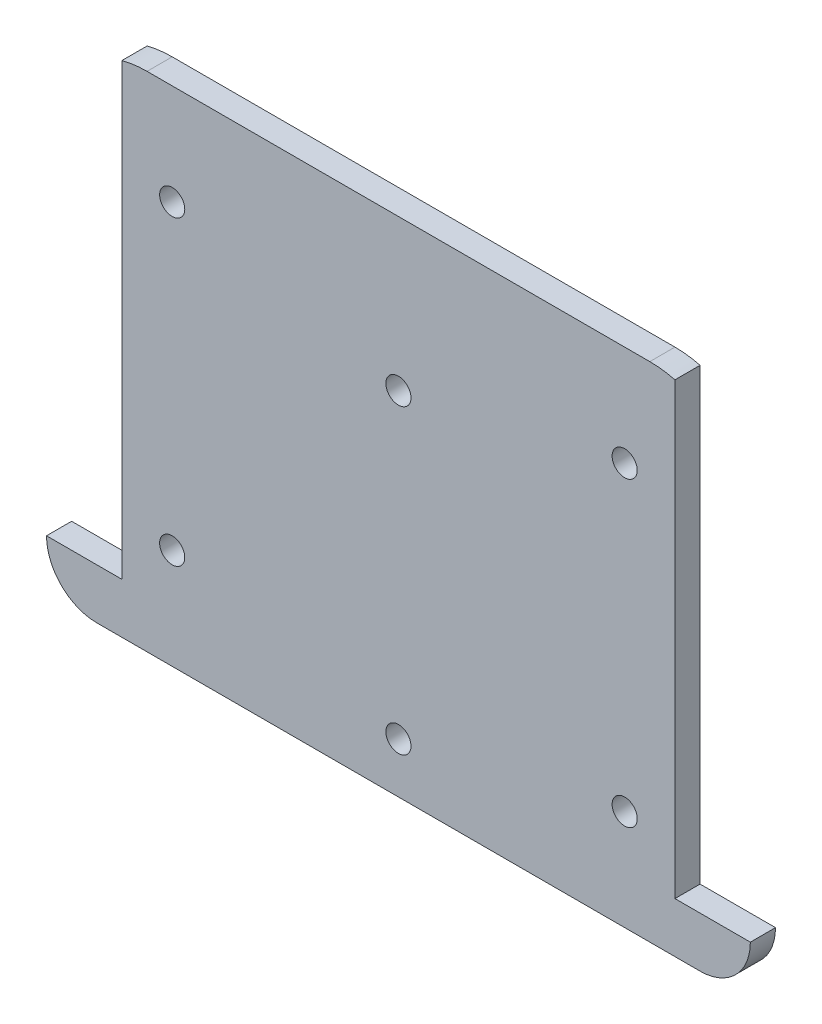
ISO-10303-21;
HEADER;
FILE_DESCRIPTION(('STEP AP214'),'2;1');
FILE_NAME('part.step','',(''),(''),'','','');
FILE_SCHEMA(('AUTOMOTIVE_DESIGN { 1 0 10303 214 1 1 1 1 }'));
ENDSEC;
DATA;
#1=APPLICATION_CONTEXT('core data for automotive mechanical design processes');
#2=APPLICATION_PROTOCOL_DEFINITION('international standard','automotive_design',2000,#1);
#3=PRODUCT_CONTEXT('',#1,'mechanical');
#4=PRODUCT('Part','Part','',(#3));
#5=PRODUCT_RELATED_PRODUCT_CATEGORY('part','',(#4));
#6=PRODUCT_DEFINITION_FORMATION('','',#4);
#7=PRODUCT_DEFINITION_CONTEXT('part definition',#1,'design');
#8=PRODUCT_DEFINITION('design','',#6,#7);
#9=PRODUCT_DEFINITION_SHAPE('','',#8);
#10=(LENGTH_UNIT() NAMED_UNIT(*) SI_UNIT(.MILLI.,.METRE.));
#11=(NAMED_UNIT(*) PLANE_ANGLE_UNIT() SI_UNIT($,.RADIAN.));
#12=(NAMED_UNIT(*) SI_UNIT($,.STERADIAN.) SOLID_ANGLE_UNIT());
#13=UNCERTAINTY_MEASURE_WITH_UNIT(LENGTH_MEASURE(1.E-05),#10,'distance_accuracy_value','');
#14=(GEOMETRIC_REPRESENTATION_CONTEXT(3) GLOBAL_UNCERTAINTY_ASSIGNED_CONTEXT((#13)) GLOBAL_UNIT_ASSIGNED_CONTEXT((#10,
#11,#12)) REPRESENTATION_CONTEXT('',''));
#15=CARTESIAN_POINT('',(0.,0.,0.));
#16=DIRECTION('',(0.,0.,1.));
#17=DIRECTION('',(1.,0.,0.));
#18=AXIS2_PLACEMENT_3D('',#15,#16,#17);
#19=CARTESIAN_POINT('',(60.,-40.,5.));
#20=DIRECTION('',(0.,0.,-1.));
#21=DIRECTION('',(-1.,0.,0.));
#22=AXIS2_PLACEMENT_3D('',#19,#20,#21);
#23=CYLINDRICAL_SURFACE('',#22,9.99999999999999);
#24=CARTESIAN_POINT('',(60.,-40.,0.));
#25=DIRECTION('',(0.,0.,1.));
#26=DIRECTION('',(1.,0.,0.));
#27=AXIS2_PLACEMENT_3D('',#24,#25,#26);
#28=CIRCLE('',#27,9.99999999999999);
#29=CARTESIAN_POINT('',(59.9999999999999,-50.,0.));
#30=VERTEX_POINT('',#29);
#31=CARTESIAN_POINT('',(70.,-39.9999999999999,0.));
#32=VERTEX_POINT('',#31);
#33=EDGE_CURVE('E133',#30,#32,#28,.T.);
#34=ORIENTED_EDGE('',*,*,#33,.T.);
#35=DIRECTION('',(0.,0.,-1.));
#36=VECTOR('',#35,1.);
#37=CARTESIAN_POINT('',(70.,-39.9999999999999,5.));
#38=LINE('',#37,#36);
#39=CARTESIAN_POINT('',(70.,-39.9999999999999,5.));
#40=VERTEX_POINT('',#39);
#41=EDGE_CURVE('E11',#40,#32,#38,.T.);
#42=ORIENTED_EDGE('',*,*,#41,.F.);
#43=CARTESIAN_POINT('',(60.,-40.,5.));
#44=DIRECTION('',(0.,0.,1.));
#45=DIRECTION('',(1.,0.,0.));
#46=AXIS2_PLACEMENT_3D('',#43,#44,#45);
#47=CIRCLE('',#46,9.99999999999999);
#48=CARTESIAN_POINT('',(59.9999999999999,-50.,5.));
#49=VERTEX_POINT('',#48);
#50=EDGE_CURVE('E148',#49,#40,#47,.T.);
#51=ORIENTED_EDGE('',*,*,#50,.F.);
#52=DIRECTION('',(0.,0.,-1.));
#53=VECTOR('',#52,1.);
#54=CARTESIAN_POINT('',(59.9999999999999,-50.,5.));
#55=LINE('',#54,#53);
#56=EDGE_CURVE('E149',#49,#30,#55,.T.);
#57=ORIENTED_EDGE('',*,*,#56,.T.);
#58=EDGE_LOOP('',(#34,#42,#51,#57));
#59=FACE_BOUND('',#58,.T.);
#60=ADVANCED_FACE('F35',(#59),#23,.T.);
#61=CARTESIAN_POINT('',(50.,30.,5.));
#62=DIRECTION('',(0.,0.,-1.));
#63=DIRECTION('',(-1.,0.,0.));
#64=AXIS2_PLACEMENT_3D('',#61,#62,#63);
#65=CYLINDRICAL_SURFACE('',#64,20.);
#66=CARTESIAN_POINT('',(50.,30.,5.));
#67=DIRECTION('',(0.,0.,1.));
#68=DIRECTION('',(-1.,0.,0.));
#69=AXIS2_PLACEMENT_3D('',#66,#67,#68);
#70=CIRCLE('',#69,20.);
#71=CARTESIAN_POINT('',(55.,49.3649167310371,5.));
#72=VERTEX_POINT('',#71);
#73=CARTESIAN_POINT('',(50.,50.,5.));
#74=VERTEX_POINT('',#73);
#75=EDGE_CURVE('E127',#72,#74,#70,.T.);
#76=ORIENTED_EDGE('',*,*,#75,.F.);
#77=DIRECTION('',(0.,0.,1.));
#78=VECTOR('',#77,1.);
#79=CARTESIAN_POINT('',(55.,49.3649167310371,0.));
#80=LINE('',#79,#78);
#81=CARTESIAN_POINT('',(55.,49.3649167310371,0.));
#82=VERTEX_POINT('',#81);
#83=EDGE_CURVE('E114',#82,#72,#80,.T.);
#84=ORIENTED_EDGE('',*,*,#83,.F.);
#85=CARTESIAN_POINT('',(50.,30.,0.));
#86=DIRECTION('',(0.,0.,1.));
#87=DIRECTION('',(-1.,0.,0.));
#88=AXIS2_PLACEMENT_3D('',#85,#86,#87);
#89=CIRCLE('',#88,20.);
#90=CARTESIAN_POINT('',(50.,50.,0.));
#91=VERTEX_POINT('',#90);
#92=EDGE_CURVE('E125',#82,#91,#89,.T.);
#93=ORIENTED_EDGE('',*,*,#92,.T.);
#94=DIRECTION('',(0.,0.,-1.));
#95=VECTOR('',#94,1.);
#96=CARTESIAN_POINT('',(50.,50.,5.));
#97=LINE('',#96,#95);
#98=EDGE_CURVE('E42',#74,#91,#97,.T.);
#99=ORIENTED_EDGE('',*,*,#98,.F.);
#100=EDGE_LOOP('',(#76,#84,#93,#99));
#101=FACE_BOUND('',#100,.T.);
#102=ADVANCED_FACE('F123',(#101),#65,.T.);
#103=CARTESIAN_POINT('',(-50.,50.,5.));
#104=DIRECTION('',(0.,-1.,0.));
#105=DIRECTION('',(0.,0.,-1.));
#106=AXIS2_PLACEMENT_3D('',#103,#104,#105);
#107=PLANE('',#106);
#108=DIRECTION('',(-1.,0.,0.));
#109=VECTOR('',#108,1.);
#110=CARTESIAN_POINT('',(-50.,50.,0.));
#111=LINE('',#110,#109);
#112=CARTESIAN_POINT('',(-50.,50.,0.));
#113=VERTEX_POINT('',#112);
#114=EDGE_CURVE('E132',#91,#113,#111,.T.);
#115=ORIENTED_EDGE('',*,*,#114,.T.);
#116=DIRECTION('',(0.,0.,-1.));
#117=VECTOR('',#116,1.);
#118=CARTESIAN_POINT('',(-50.,50.,5.));
#119=LINE('',#118,#117);
#120=CARTESIAN_POINT('',(-50.,50.,5.));
#121=VERTEX_POINT('',#120);
#122=EDGE_CURVE('E159',#121,#113,#119,.T.);
#123=ORIENTED_EDGE('',*,*,#122,.F.);
#124=DIRECTION('',(-1.,0.,0.));
#125=VECTOR('',#124,1.);
#126=CARTESIAN_POINT('',(-50.,50.,5.));
#127=LINE('',#126,#125);
#128=EDGE_CURVE('E165',#74,#121,#127,.T.);
#129=ORIENTED_EDGE('',*,*,#128,.F.);
#130=ORIENTED_EDGE('',*,*,#98,.T.);
#131=EDGE_LOOP('',(#115,#123,#129,#130));
#132=FACE_BOUND('',#131,.T.);
#133=ADVANCED_FACE('F163',(#132),#107,.F.);
#134=CARTESIAN_POINT('',(-50.,30.,5.));
#135=DIRECTION('',(0.,0.,-1.));
#136=DIRECTION('',(-1.,0.,0.));
#137=AXIS2_PLACEMENT_3D('',#134,#135,#136);
#138=CYLINDRICAL_SURFACE('',#137,20.);
#139=CARTESIAN_POINT('',(-50.,30.,0.));
#140=DIRECTION('',(0.,0.,1.));
#141=DIRECTION('',(-1.,0.,0.));
#142=AXIS2_PLACEMENT_3D('',#139,#140,#141);
#143=CIRCLE('',#142,20.);
#144=CARTESIAN_POINT('',(-55.,49.3649167310371,0.));
#145=VERTEX_POINT('',#144);
#146=EDGE_CURVE('E135',#113,#145,#143,.T.);
#147=ORIENTED_EDGE('',*,*,#146,.T.);
#148=DIRECTION('',(0.,0.,1.));
#149=VECTOR('',#148,1.);
#150=CARTESIAN_POINT('',(-55.,49.3649167310371,0.));
#151=LINE('',#150,#149);
#152=CARTESIAN_POINT('',(-55.,49.3649167310371,5.));
#153=VERTEX_POINT('',#152);
#154=EDGE_CURVE('E56',#145,#153,#151,.T.);
#155=ORIENTED_EDGE('',*,*,#154,.T.);
#156=CARTESIAN_POINT('',(-50.,30.,5.));
#157=DIRECTION('',(0.,0.,1.));
#158=DIRECTION('',(-1.,0.,0.));
#159=AXIS2_PLACEMENT_3D('',#156,#157,#158);
#160=CIRCLE('',#159,20.);
#161=EDGE_CURVE('E169',#121,#153,#160,.T.);
#162=ORIENTED_EDGE('',*,*,#161,.F.);
#163=ORIENTED_EDGE('',*,*,#122,.T.);
#164=EDGE_LOOP('',(#147,#155,#162,#163));
#165=FACE_BOUND('',#164,.T.);
#166=ADVANCED_FACE('F276',(#165),#138,.T.);
#167=CARTESIAN_POINT('',(-60.,-40.,5.));
#168=DIRECTION('',(0.,0.,-1.));
#169=DIRECTION('',(-1.,0.,0.));
#170=AXIS2_PLACEMENT_3D('',#167,#168,#169);
#171=CYLINDRICAL_SURFACE('',#170,9.99999999999999);
#172=CARTESIAN_POINT('',(-60.,-40.,0.));
#173=DIRECTION('',(0.,0.,1.));
#174=DIRECTION('',(-1.,0.,0.));
#175=AXIS2_PLACEMENT_3D('',#172,#173,#174);
#176=CIRCLE('',#175,9.99999999999999);
#177=CARTESIAN_POINT('',(-70.,-39.9999999999999,0.));
#178=VERTEX_POINT('',#177);
#179=CARTESIAN_POINT('',(-59.9999999999999,-50.,0.));
#180=VERTEX_POINT('',#179);
#181=EDGE_CURVE('E144',#178,#180,#176,.T.);
#182=ORIENTED_EDGE('',*,*,#181,.T.);
#183=DIRECTION('',(0.,0.,-1.));
#184=VECTOR('',#183,1.);
#185=CARTESIAN_POINT('',(-59.9999999999999,-50.,5.));
#186=LINE('',#185,#184);
#187=CARTESIAN_POINT('',(-59.9999999999999,-50.,5.));
#188=VERTEX_POINT('',#187);
#189=EDGE_CURVE('E152',#188,#180,#186,.T.);
#190=ORIENTED_EDGE('',*,*,#189,.F.);
#191=CARTESIAN_POINT('',(-60.,-40.,5.));
#192=DIRECTION('',(0.,0.,1.));
#193=DIRECTION('',(-1.,0.,0.));
#194=AXIS2_PLACEMENT_3D('',#191,#192,#193);
#195=CIRCLE('',#194,9.99999999999999);
#196=CARTESIAN_POINT('',(-70.,-39.9999999999999,5.));
#197=VERTEX_POINT('',#196);
#198=EDGE_CURVE('E171',#197,#188,#195,.T.);
#199=ORIENTED_EDGE('',*,*,#198,.F.);
#200=DIRECTION('',(0.,0.,-1.));
#201=VECTOR('',#200,1.);
#202=CARTESIAN_POINT('',(-70.,-40.,5.));
#203=LINE('',#202,#201);
#204=EDGE_CURVE('E156',#197,#178,#203,.T.);
#205=ORIENTED_EDGE('',*,*,#204,.T.);
#206=EDGE_LOOP('',(#182,#190,#199,#205));
#207=FACE_BOUND('',#206,.T.);
#208=ADVANCED_FACE('F264',(#207),#171,.T.);
#209=CARTESIAN_POINT('',(-59.9999999999999,-50.,5.));
#210=DIRECTION('',(0.,1.,0.));
#211=DIRECTION('',(0.,0.,1.));
#212=AXIS2_PLACEMENT_3D('',#209,#210,#211);
#213=PLANE('',#212);
#214=DIRECTION('',(1.,0.,0.));
#215=VECTOR('',#214,1.);
#216=CARTESIAN_POINT('',(-59.9999999999999,-50.,0.));
#217=LINE('',#216,#215);
#218=EDGE_CURVE('E146',#180,#30,#217,.T.);
#219=ORIENTED_EDGE('',*,*,#218,.T.);
#220=ORIENTED_EDGE('',*,*,#56,.F.);
#221=DIRECTION('',(1.,0.,0.));
#222=VECTOR('',#221,1.);
#223=CARTESIAN_POINT('',(-59.9999999999999,-50.,5.));
#224=LINE('',#223,#222);
#225=EDGE_CURVE('E153',#188,#49,#224,.T.);
#226=ORIENTED_EDGE('',*,*,#225,.F.);
#227=ORIENTED_EDGE('',*,*,#189,.T.);
#228=EDGE_LOOP('',(#219,#220,#226,#227));
#229=FACE_BOUND('',#228,.T.);
#230=ADVANCED_FACE('F188',(#229),#213,.F.);
#231=CARTESIAN_POINT('',(60.,-40.,5.));
#232=DIRECTION('',(0.,0.,1.));
#233=DIRECTION('',(1.,0.,0.));
#234=AXIS2_PLACEMENT_3D('',#231,#232,#233);
#235=PLANE('',#234);
#236=CARTESIAN_POINT('',(0.,20.,5.));
#237=DIRECTION('',(0.,0.,1.));
#238=DIRECTION('',(1.,0.,0.));
#239=AXIS2_PLACEMENT_3D('',#236,#237,#238);
#240=CIRCLE('',#239,2.5);
#241=CARTESIAN_POINT('',(2.5,20.,5.));
#242=VERTEX_POINT('',#241);
#243=EDGE_CURVE('E241',#242,#242,#240,.T.);
#244=ORIENTED_EDGE('',*,*,#243,.F.);
#245=EDGE_LOOP('',(#244));
#246=FACE_BOUND('',#245,.T.);
#247=DIRECTION('',(1.,0.,0.));
#248=VECTOR('',#247,1.);
#249=CARTESIAN_POINT('',(70.,-39.9999999999999,5.));
#250=LINE('',#249,#248);
#251=CARTESIAN_POINT('',(55.,-39.9999999999999,5.));
#252=VERTEX_POINT('',#251);
#253=EDGE_CURVE('E119',#252,#40,#250,.T.);
#254=ORIENTED_EDGE('',*,*,#253,.F.);
#255=DIRECTION('',(0.,-1.,0.));
#256=VECTOR('',#255,1.);
#257=CARTESIAN_POINT('',(55.,-39.9999999999999,5.));
#258=LINE('',#257,#256);
#259=EDGE_CURVE('E226',#72,#252,#258,.T.);
#260=ORIENTED_EDGE('',*,*,#259,.F.);
#261=ORIENTED_EDGE('',*,*,#75,.T.);
#262=ORIENTED_EDGE('',*,*,#128,.T.);
#263=ORIENTED_EDGE('',*,*,#161,.T.);
#264=DIRECTION('',(0.,1.,0.));
#265=VECTOR('',#264,1.);
#266=CARTESIAN_POINT('',(-55.,-39.9999999999999,5.));
#267=LINE('',#266,#265);
#268=CARTESIAN_POINT('',(-55.,-39.9999999999999,5.));
#269=VERTEX_POINT('',#268);
#270=EDGE_CURVE('E227',#269,#153,#267,.T.);
#271=ORIENTED_EDGE('',*,*,#270,.F.);
#272=DIRECTION('',(1.,0.,0.));
#273=VECTOR('',#272,1.);
#274=CARTESIAN_POINT('',(-70.,-39.9999999999999,5.));
#275=LINE('',#274,#273);
#276=EDGE_CURVE('E230',#197,#269,#275,.T.);
#277=ORIENTED_EDGE('',*,*,#276,.F.);
#278=ORIENTED_EDGE('',*,*,#198,.T.);
#279=ORIENTED_EDGE('',*,*,#225,.T.);
#280=ORIENTED_EDGE('',*,*,#50,.T.);
#281=EDGE_LOOP('',(#254,#260,#261,#262,#263,#271,#277,#278,#279,#280));
#282=FACE_BOUND('',#281,.T.);
#283=CARTESIAN_POINT('',(0.,-40.,5.));
#284=DIRECTION('',(0.,0.,1.));
#285=DIRECTION('',(1.,0.,0.));
#286=AXIS2_PLACEMENT_3D('',#283,#284,#285);
#287=CIRCLE('',#286,2.5);
#288=CARTESIAN_POINT('',(2.5,-40.,5.));
#289=VERTEX_POINT('',#288);
#290=EDGE_CURVE('E206',#289,#289,#287,.T.);
#291=ORIENTED_EDGE('',*,*,#290,.F.);
#292=EDGE_LOOP('',(#291));
#293=FACE_BOUND('',#292,.T.);
#294=CARTESIAN_POINT('',(45.,30.,5.));
#295=DIRECTION('',(0.,0.,1.));
#296=DIRECTION('',(-1.,0.,0.));
#297=AXIS2_PLACEMENT_3D('',#294,#295,#296);
#298=CIRCLE('',#297,2.5);
#299=CARTESIAN_POINT('',(42.5,30.,5.));
#300=VERTEX_POINT('',#299);
#301=EDGE_CURVE('E199',#300,#300,#298,.T.);
#302=ORIENTED_EDGE('',*,*,#301,.F.);
#303=EDGE_LOOP('',(#302));
#304=FACE_BOUND('',#303,.T.);
#305=CARTESIAN_POINT('',(-45.,-30.,5.));
#306=DIRECTION('',(0.,0.,1.));
#307=DIRECTION('',(-1.,0.,0.));
#308=AXIS2_PLACEMENT_3D('',#305,#306,#307);
#309=CIRCLE('',#308,2.5);
#310=CARTESIAN_POINT('',(-47.5,-30.,5.));
#311=VERTEX_POINT('',#310);
#312=EDGE_CURVE('E217',#311,#311,#309,.T.);
#313=ORIENTED_EDGE('',*,*,#312,.F.);
#314=EDGE_LOOP('',(#313));
#315=FACE_BOUND('',#314,.T.);
#316=CARTESIAN_POINT('',(45.,-30.,5.));
#317=DIRECTION('',(0.,0.,1.));
#318=DIRECTION('',(1.,0.,0.));
#319=AXIS2_PLACEMENT_3D('',#316,#317,#318);
#320=CIRCLE('',#319,2.5);
#321=CARTESIAN_POINT('',(47.5,-30.,5.));
#322=VERTEX_POINT('',#321);
#323=EDGE_CURVE('E211',#322,#322,#320,.T.);
#324=ORIENTED_EDGE('',*,*,#323,.F.);
#325=EDGE_LOOP('',(#324));
#326=FACE_BOUND('',#325,.T.);
#327=CARTESIAN_POINT('',(-45.,30.,5.));
#328=DIRECTION('',(0.,0.,1.));
#329=DIRECTION('',(1.,0.,0.));
#330=AXIS2_PLACEMENT_3D('',#327,#328,#329);
#331=CIRCLE('',#330,2.5);
#332=CARTESIAN_POINT('',(-42.5,30.,5.));
#333=VERTEX_POINT('',#332);
#334=EDGE_CURVE('E193',#333,#333,#331,.T.);
#335=ORIENTED_EDGE('',*,*,#334,.F.);
#336=EDGE_LOOP('',(#335));
#337=FACE_BOUND('',#336,.T.);
#338=ADVANCED_FACE('F180',(#246,#282,#293,#304,#315,#326,#337),#235,.T.);
#339=CARTESIAN_POINT('',(60.,-40.,0.));
#340=DIRECTION('',(0.,0.,1.));
#341=DIRECTION('',(1.,0.,0.));
#342=AXIS2_PLACEMENT_3D('',#339,#340,#341);
#343=PLANE('',#342);
#344=CARTESIAN_POINT('',(0.,20.,0.));
#345=DIRECTION('',(0.,0.,1.));
#346=DIRECTION('',(1.,0.,0.));
#347=AXIS2_PLACEMENT_3D('',#344,#345,#346);
#348=CIRCLE('',#347,2.5);
#349=CARTESIAN_POINT('',(2.5,20.,0.));
#350=VERTEX_POINT('',#349);
#351=EDGE_CURVE('E233',#350,#350,#348,.T.);
#352=ORIENTED_EDGE('',*,*,#351,.T.);
#353=EDGE_LOOP('',(#352));
#354=FACE_BOUND('',#353,.T.);
#355=CARTESIAN_POINT('',(0.,-40.,0.));
#356=DIRECTION('',(0.,0.,1.));
#357=DIRECTION('',(1.,0.,0.));
#358=AXIS2_PLACEMENT_3D('',#355,#356,#357);
#359=CIRCLE('',#358,2.5);
#360=CARTESIAN_POINT('',(2.5,-40.,0.));
#361=VERTEX_POINT('',#360);
#362=EDGE_CURVE('E196',#361,#361,#359,.T.);
#363=ORIENTED_EDGE('',*,*,#362,.T.);
#364=EDGE_LOOP('',(#363));
#365=FACE_BOUND('',#364,.T.);
#366=CARTESIAN_POINT('',(45.,30.,0.));
#367=DIRECTION('',(0.,0.,1.));
#368=DIRECTION('',(-1.,0.,0.));
#369=AXIS2_PLACEMENT_3D('',#366,#367,#368);
#370=CIRCLE('',#369,2.5);
#371=CARTESIAN_POINT('',(42.5,30.,0.));
#372=VERTEX_POINT('',#371);
#373=EDGE_CURVE('E202',#372,#372,#370,.T.);
#374=ORIENTED_EDGE('',*,*,#373,.T.);
#375=EDGE_LOOP('',(#374));
#376=FACE_BOUND('',#375,.T.);
#377=CARTESIAN_POINT('',(-45.,-30.,0.));
#378=DIRECTION('',(0.,0.,1.));
#379=DIRECTION('',(-1.,0.,0.));
#380=AXIS2_PLACEMENT_3D('',#377,#378,#379);
#381=CIRCLE('',#380,2.5);
#382=CARTESIAN_POINT('',(-47.5,-30.,0.));
#383=VERTEX_POINT('',#382);
#384=EDGE_CURVE('E203',#383,#383,#381,.T.);
#385=ORIENTED_EDGE('',*,*,#384,.T.);
#386=EDGE_LOOP('',(#385));
#387=FACE_BOUND('',#386,.T.);
#388=CARTESIAN_POINT('',(45.,-30.,0.));
#389=DIRECTION('',(0.,0.,1.));
#390=DIRECTION('',(1.,0.,0.));
#391=AXIS2_PLACEMENT_3D('',#388,#389,#390);
#392=CIRCLE('',#391,2.5);
#393=CARTESIAN_POINT('',(47.5,-30.,0.));
#394=VERTEX_POINT('',#393);
#395=EDGE_CURVE('E214',#394,#394,#392,.T.);
#396=ORIENTED_EDGE('',*,*,#395,.T.);
#397=EDGE_LOOP('',(#396));
#398=FACE_BOUND('',#397,.T.);
#399=CARTESIAN_POINT('',(-45.,30.,0.));
#400=DIRECTION('',(0.,0.,1.));
#401=DIRECTION('',(1.,0.,0.));
#402=AXIS2_PLACEMENT_3D('',#399,#400,#401);
#403=CIRCLE('',#402,2.5);
#404=CARTESIAN_POINT('',(-42.5,30.,0.));
#405=VERTEX_POINT('',#404);
#406=EDGE_CURVE('E138',#405,#405,#403,.T.);
#407=ORIENTED_EDGE('',*,*,#406,.T.);
#408=EDGE_LOOP('',(#407));
#409=FACE_BOUND('',#408,.T.);
#410=DIRECTION('',(0.,-1.,0.));
#411=VECTOR('',#410,1.);
#412=CARTESIAN_POINT('',(55.,-39.9999999999999,0.));
#413=LINE('',#412,#411);
#414=CARTESIAN_POINT('',(55.,-39.9999999999999,0.));
#415=VERTEX_POINT('',#414);
#416=EDGE_CURVE('E110',#82,#415,#413,.T.);
#417=ORIENTED_EDGE('',*,*,#416,.T.);
#418=DIRECTION('',(1.,0.,0.));
#419=VECTOR('',#418,1.);
#420=CARTESIAN_POINT('',(70.,-39.9999999999999,0.));
#421=LINE('',#420,#419);
#422=EDGE_CURVE('E48',#415,#32,#421,.T.);
#423=ORIENTED_EDGE('',*,*,#422,.T.);
#424=ORIENTED_EDGE('',*,*,#33,.F.);
#425=ORIENTED_EDGE('',*,*,#218,.F.);
#426=ORIENTED_EDGE('',*,*,#181,.F.);
#427=DIRECTION('',(1.,0.,0.));
#428=VECTOR('',#427,1.);
#429=CARTESIAN_POINT('',(-70.,-39.9999999999999,0.));
#430=LINE('',#429,#428);
#431=CARTESIAN_POINT('',(-55.,-39.9999999999999,0.));
#432=VERTEX_POINT('',#431);
#433=EDGE_CURVE('E229',#178,#432,#430,.T.);
#434=ORIENTED_EDGE('',*,*,#433,.T.);
#435=DIRECTION('',(0.,1.,0.));
#436=VECTOR('',#435,1.);
#437=CARTESIAN_POINT('',(-55.,-39.9999999999999,0.));
#438=LINE('',#437,#436);
#439=EDGE_CURVE('E224',#432,#145,#438,.T.);
#440=ORIENTED_EDGE('',*,*,#439,.T.);
#441=ORIENTED_EDGE('',*,*,#146,.F.);
#442=ORIENTED_EDGE('',*,*,#114,.F.);
#443=ORIENTED_EDGE('',*,*,#92,.F.);
#444=EDGE_LOOP('',(#417,#423,#424,#425,#426,#434,#440,#441,#442,#443));
#445=FACE_BOUND('',#444,.T.);
#446=ADVANCED_FACE('F130',(#354,#365,#376,#387,#398,#409,#445),#343,.F.);
#447=CARTESIAN_POINT('',(-45.,30.,0.));
#448=DIRECTION('',(0.,0.,1.));
#449=DIRECTION('',(1.,0.,0.));
#450=AXIS2_PLACEMENT_3D('',#447,#448,#449);
#451=CYLINDRICAL_SURFACE('',#450,2.5);
#452=ORIENTED_EDGE('',*,*,#406,.F.);
#453=EDGE_LOOP('',(#452));
#454=FACE_BOUND('',#453,.T.);
#455=ORIENTED_EDGE('',*,*,#334,.T.);
#456=EDGE_LOOP('',(#455));
#457=FACE_BOUND('',#456,.T.);
#458=ADVANCED_FACE('F261',(#454,#457),#451,.F.);
#459=CARTESIAN_POINT('',(45.,-30.,0.));
#460=DIRECTION('',(0.,0.,1.));
#461=DIRECTION('',(1.,0.,0.));
#462=AXIS2_PLACEMENT_3D('',#459,#460,#461);
#463=CYLINDRICAL_SURFACE('',#462,2.5);
#464=ORIENTED_EDGE('',*,*,#395,.F.);
#465=EDGE_LOOP('',(#464));
#466=FACE_BOUND('',#465,.T.);
#467=ORIENTED_EDGE('',*,*,#323,.T.);
#468=EDGE_LOOP('',(#467));
#469=FACE_BOUND('',#468,.T.);
#470=ADVANCED_FACE('F307',(#466,#469),#463,.F.);
#471=CARTESIAN_POINT('',(-45.,-30.,0.));
#472=DIRECTION('',(0.,0.,1.));
#473=DIRECTION('',(1.,0.,0.));
#474=AXIS2_PLACEMENT_3D('',#471,#472,#473);
#475=CYLINDRICAL_SURFACE('',#474,2.5);
#476=ORIENTED_EDGE('',*,*,#384,.F.);
#477=EDGE_LOOP('',(#476));
#478=FACE_BOUND('',#477,.T.);
#479=ORIENTED_EDGE('',*,*,#312,.T.);
#480=EDGE_LOOP('',(#479));
#481=FACE_BOUND('',#480,.T.);
#482=ADVANCED_FACE('F303',(#478,#481),#475,.F.);
#483=CARTESIAN_POINT('',(45.,30.,0.));
#484=DIRECTION('',(0.,0.,1.));
#485=DIRECTION('',(1.,0.,0.));
#486=AXIS2_PLACEMENT_3D('',#483,#484,#485);
#487=CYLINDRICAL_SURFACE('',#486,2.5);
#488=ORIENTED_EDGE('',*,*,#373,.F.);
#489=EDGE_LOOP('',(#488));
#490=FACE_BOUND('',#489,.T.);
#491=ORIENTED_EDGE('',*,*,#301,.T.);
#492=EDGE_LOOP('',(#491));
#493=FACE_BOUND('',#492,.T.);
#494=ADVANCED_FACE('F306',(#490,#493),#487,.F.);
#495=CARTESIAN_POINT('',(0.,-40.,0.));
#496=DIRECTION('',(0.,0.,1.));
#497=DIRECTION('',(1.,0.,0.));
#498=AXIS2_PLACEMENT_3D('',#495,#496,#497);
#499=CYLINDRICAL_SURFACE('',#498,2.5);
#500=ORIENTED_EDGE('',*,*,#362,.F.);
#501=EDGE_LOOP('',(#500));
#502=FACE_BOUND('',#501,.T.);
#503=ORIENTED_EDGE('',*,*,#290,.T.);
#504=EDGE_LOOP('',(#503));
#505=FACE_BOUND('',#504,.T.);
#506=ADVANCED_FACE('F299',(#502,#505),#499,.F.);
#507=CARTESIAN_POINT('',(-70.,-39.9999999999999,0.));
#508=DIRECTION('',(0.,-1.,0.));
#509=DIRECTION('',(0.,0.,-1.));
#510=AXIS2_PLACEMENT_3D('',#507,#508,#509);
#511=PLANE('',#510);
#512=ORIENTED_EDGE('',*,*,#276,.T.);
#513=DIRECTION('',(0.,0.,1.));
#514=VECTOR('',#513,1.);
#515=CARTESIAN_POINT('',(-55.,-39.9999999999999,0.));
#516=LINE('',#515,#514);
#517=EDGE_CURVE('E222',#432,#269,#516,.T.);
#518=ORIENTED_EDGE('',*,*,#517,.F.);
#519=ORIENTED_EDGE('',*,*,#433,.F.);
#520=ORIENTED_EDGE('',*,*,#204,.F.);
#521=EDGE_LOOP('',(#512,#518,#519,#520));
#522=FACE_BOUND('',#521,.T.);
#523=ADVANCED_FACE('F288',(#522),#511,.F.);
#524=CARTESIAN_POINT('',(-55.,-39.9999999999999,0.));
#525=DIRECTION('',(1.,0.,0.));
#526=DIRECTION('',(0.,0.,-1.));
#527=AXIS2_PLACEMENT_3D('',#524,#525,#526);
#528=PLANE('',#527);
#529=ORIENTED_EDGE('',*,*,#270,.T.);
#530=ORIENTED_EDGE('',*,*,#154,.F.);
#531=ORIENTED_EDGE('',*,*,#439,.F.);
#532=ORIENTED_EDGE('',*,*,#517,.T.);
#533=EDGE_LOOP('',(#529,#530,#531,#532));
#534=FACE_BOUND('',#533,.T.);
#535=ADVANCED_FACE('F290',(#534),#528,.F.);
#536=CARTESIAN_POINT('',(70.,-39.9999999999999,0.));
#537=DIRECTION('',(0.,-1.,0.));
#538=DIRECTION('',(0.,0.,-1.));
#539=AXIS2_PLACEMENT_3D('',#536,#537,#538);
#540=PLANE('',#539);
#541=ORIENTED_EDGE('',*,*,#253,.T.);
#542=ORIENTED_EDGE('',*,*,#41,.T.);
#543=ORIENTED_EDGE('',*,*,#422,.F.);
#544=DIRECTION('',(0.,0.,1.));
#545=VECTOR('',#544,1.);
#546=CARTESIAN_POINT('',(55.,-39.9999999999999,0.));
#547=LINE('',#546,#545);
#548=EDGE_CURVE('E116',#415,#252,#547,.T.);
#549=ORIENTED_EDGE('',*,*,#548,.T.);
#550=EDGE_LOOP('',(#541,#542,#543,#549));
#551=FACE_BOUND('',#550,.T.);
#552=ADVANCED_FACE('F292',(#551),#540,.F.);
#553=CARTESIAN_POINT('',(55.,-39.9999999999999,0.));
#554=DIRECTION('',(-1.,0.,0.));
#555=DIRECTION('',(0.,0.,1.));
#556=AXIS2_PLACEMENT_3D('',#553,#554,#555);
#557=PLANE('',#556);
#558=ORIENTED_EDGE('',*,*,#259,.T.);
#559=ORIENTED_EDGE('',*,*,#548,.F.);
#560=ORIENTED_EDGE('',*,*,#416,.F.);
#561=ORIENTED_EDGE('',*,*,#83,.T.);
#562=EDGE_LOOP('',(#558,#559,#560,#561));
#563=FACE_BOUND('',#562,.T.);
#564=ADVANCED_FACE('F113',(#563),#557,.F.);
#565=CARTESIAN_POINT('',(0.,20.,0.));
#566=DIRECTION('',(0.,0.,1.));
#567=DIRECTION('',(1.,0.,0.));
#568=AXIS2_PLACEMENT_3D('',#565,#566,#567);
#569=CYLINDRICAL_SURFACE('',#568,2.5);
#570=ORIENTED_EDGE('',*,*,#351,.F.);
#571=EDGE_LOOP('',(#570));
#572=FACE_BOUND('',#571,.T.);
#573=ORIENTED_EDGE('',*,*,#243,.T.);
#574=EDGE_LOOP('',(#573));
#575=FACE_BOUND('',#574,.T.);
#576=ADVANCED_FACE('F249',(#572,#575),#569,.F.);
#577=CLOSED_SHELL('',(#60,#102,#133,#166,#208,#230,#338,#446,#458,#470,#482,#494,#506,#523,#535,
#552,#564,#576));
#578=MANIFOLD_SOLID_BREP('B2',#577);
#579=ADVANCED_BREP_SHAPE_REPRESENTATION('',(#18,#578),#14);
#580=SHAPE_DEFINITION_REPRESENTATION(#9,#579);
ENDSEC;
END-ISO-10303-21;
